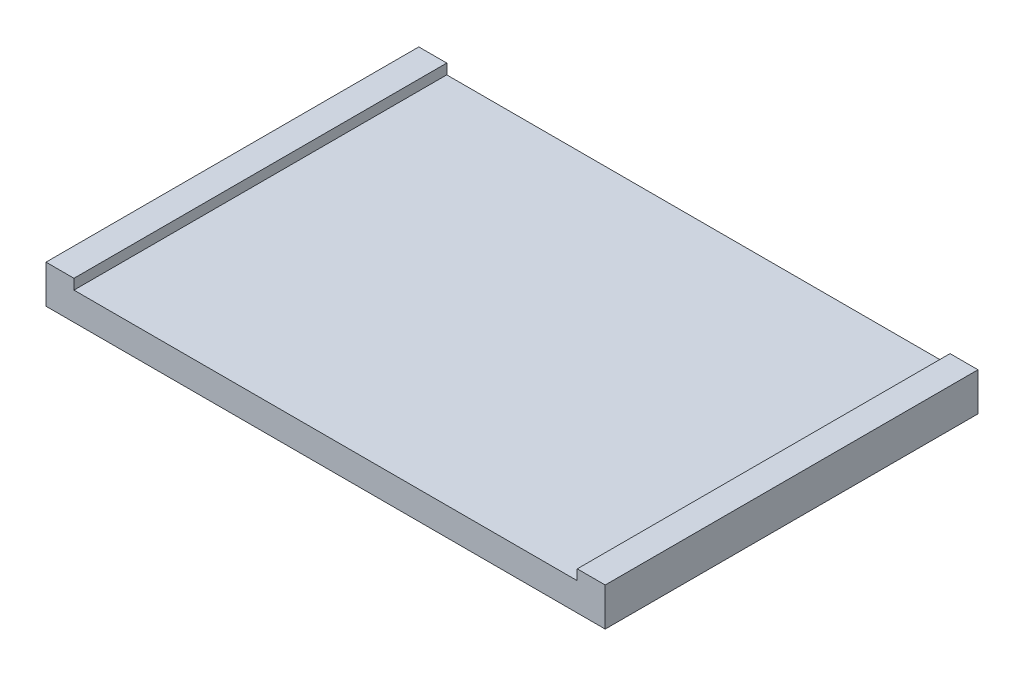
ISO-10303-21;
HEADER;
FILE_DESCRIPTION(('STEP AP214'),'2;1');
FILE_NAME('part.step','',(''),(''),'','','');
FILE_SCHEMA(('AUTOMOTIVE_DESIGN { 1 0 10303 214 1 1 1 1 }'));
ENDSEC;
DATA;
#1=APPLICATION_CONTEXT('core data for automotive mechanical design processes');
#2=APPLICATION_PROTOCOL_DEFINITION('international standard','automotive_design',2000,#1);
#3=PRODUCT_CONTEXT('',#1,'mechanical');
#4=PRODUCT('Part','Part','',(#3));
#5=PRODUCT_RELATED_PRODUCT_CATEGORY('part','',(#4));
#6=PRODUCT_DEFINITION_FORMATION('','',#4);
#7=PRODUCT_DEFINITION_CONTEXT('part definition',#1,'design');
#8=PRODUCT_DEFINITION('design','',#6,#7);
#9=PRODUCT_DEFINITION_SHAPE('','',#8);
#10=(LENGTH_UNIT() NAMED_UNIT(*) SI_UNIT(.MILLI.,.METRE.));
#11=(NAMED_UNIT(*) PLANE_ANGLE_UNIT() SI_UNIT($,.RADIAN.));
#12=(NAMED_UNIT(*) SI_UNIT($,.STERADIAN.) SOLID_ANGLE_UNIT());
#13=UNCERTAINTY_MEASURE_WITH_UNIT(LENGTH_MEASURE(1.E-05),#10,'distance_accuracy_value','');
#14=(GEOMETRIC_REPRESENTATION_CONTEXT(3) GLOBAL_UNCERTAINTY_ASSIGNED_CONTEXT((#13)) GLOBAL_UNIT_ASSIGNED_CONTEXT((#10,
#11,#12)) REPRESENTATION_CONTEXT('',''));
#15=CARTESIAN_POINT('',(0.,0.,0.));
#16=DIRECTION('',(0.,0.,1.));
#17=DIRECTION('',(1.,0.,0.));
#18=AXIS2_PLACEMENT_3D('',#15,#16,#17);
#19=CARTESIAN_POINT('',(0.,1.5,0.));
#20=DIRECTION('',(0.,-1.,0.));
#21=DIRECTION('',(0.,0.,-1.));
#22=AXIS2_PLACEMENT_3D('',#19,#20,#21);
#23=PLANE('',#22);
#24=DIRECTION('',(0.,0.,1.));
#25=VECTOR('',#24,1.);
#26=CARTESIAN_POINT('',(28.5,1.5,0.));
#27=LINE('',#26,#25);
#28=CARTESIAN_POINT('',(28.5,1.5,-20.));
#29=VERTEX_POINT('',#28);
#30=CARTESIAN_POINT('',(28.5,1.5,0.));
#31=VERTEX_POINT('',#30);
#32=EDGE_CURVE('E114',#29,#31,#27,.T.);
#33=ORIENTED_EDGE('',*,*,#32,.F.);
#34=DIRECTION('',(-1.,0.,0.));
#35=VECTOR('',#34,1.);
#36=CARTESIAN_POINT('',(0.,1.5,-20.));
#37=LINE('',#36,#35);
#38=CARTESIAN_POINT('',(1.5,1.5,-20.));
#39=VERTEX_POINT('',#38);
#40=EDGE_CURVE('E102',#29,#39,#37,.T.);
#41=ORIENTED_EDGE('',*,*,#40,.T.);
#42=DIRECTION('',(0.,0.,-1.));
#43=VECTOR('',#42,1.);
#44=CARTESIAN_POINT('',(1.5,1.5,-20.));
#45=LINE('',#44,#43);
#46=CARTESIAN_POINT('',(1.5,1.5,0.));
#47=VERTEX_POINT('',#46);
#48=EDGE_CURVE('E58',#47,#39,#45,.T.);
#49=ORIENTED_EDGE('',*,*,#48,.F.);
#50=DIRECTION('',(1.,0.,0.));
#51=VECTOR('',#50,1.);
#52=CARTESIAN_POINT('',(0.,1.5,0.));
#53=LINE('',#52,#51);
#54=EDGE_CURVE('E53',#47,#31,#53,.T.);
#55=ORIENTED_EDGE('',*,*,#54,.T.);
#56=EDGE_LOOP('',(#33,#41,#49,#55));
#57=FACE_BOUND('',#56,.T.);
#58=ADVANCED_FACE('F38',(#57),#23,.F.);
#59=CARTESIAN_POINT('',(0.,1.5,0.));
#60=DIRECTION('',(1.,0.,0.));
#61=DIRECTION('',(0.,0.,-1.));
#62=AXIS2_PLACEMENT_3D('',#59,#60,#61);
#63=PLANE('',#62);
#64=DIRECTION('',(0.,0.,1.));
#65=VECTOR('',#64,1.);
#66=CARTESIAN_POINT('',(0.,0.,0.));
#67=LINE('',#66,#65);
#68=CARTESIAN_POINT('',(0.,0.,-20.));
#69=VERTEX_POINT('',#68);
#70=CARTESIAN_POINT('',(0.,0.,0.));
#71=VERTEX_POINT('',#70);
#72=EDGE_CURVE('E149',#69,#71,#67,.T.);
#73=ORIENTED_EDGE('',*,*,#72,.T.);
#74=DIRECTION('',(0.,-1.,0.));
#75=VECTOR('',#74,1.);
#76=CARTESIAN_POINT('',(0.,1.5,0.));
#77=LINE('',#76,#75);
#78=CARTESIAN_POINT('',(0.,2.05,0.));
#79=VERTEX_POINT('',#78);
#80=EDGE_CURVE('E11',#79,#71,#77,.T.);
#81=ORIENTED_EDGE('',*,*,#80,.F.);
#82=DIRECTION('',(0.,0.,1.));
#83=VECTOR('',#82,1.);
#84=CARTESIAN_POINT('',(0.,2.05,0.));
#85=LINE('',#84,#83);
#86=CARTESIAN_POINT('',(0.,2.05,-20.));
#87=VERTEX_POINT('',#86);
#88=EDGE_CURVE('E134',#87,#79,#85,.T.);
#89=ORIENTED_EDGE('',*,*,#88,.F.);
#90=DIRECTION('',(0.,-1.,0.));
#91=VECTOR('',#90,1.);
#92=CARTESIAN_POINT('',(0.,1.5,-20.));
#93=LINE('',#92,#91);
#94=EDGE_CURVE('E111',#87,#69,#93,.T.);
#95=ORIENTED_EDGE('',*,*,#94,.T.);
#96=EDGE_LOOP('',(#73,#81,#89,#95));
#97=FACE_BOUND('',#96,.T.);
#98=ADVANCED_FACE('F40',(#97),#63,.F.);
#99=CARTESIAN_POINT('',(0.,1.5,0.));
#100=DIRECTION('',(0.,0.,-1.));
#101=DIRECTION('',(-1.,0.,0.));
#102=AXIS2_PLACEMENT_3D('',#99,#100,#101);
#103=PLANE('',#102);
#104=DIRECTION('',(1.,0.,0.));
#105=VECTOR('',#104,1.);
#106=CARTESIAN_POINT('',(0.,0.,0.));
#107=LINE('',#106,#105);
#108=CARTESIAN_POINT('',(30.,0.,0.));
#109=VERTEX_POINT('',#108);
#110=EDGE_CURVE('E154',#71,#109,#107,.T.);
#111=ORIENTED_EDGE('',*,*,#110,.T.);
#112=DIRECTION('',(0.,-1.,0.));
#113=VECTOR('',#112,1.);
#114=CARTESIAN_POINT('',(30.,1.5,0.));
#115=LINE('',#114,#113);
#116=CARTESIAN_POINT('',(30.,2.05,0.));
#117=VERTEX_POINT('',#116);
#118=EDGE_CURVE('E46',#117,#109,#115,.T.);
#119=ORIENTED_EDGE('',*,*,#118,.F.);
#120=DIRECTION('',(1.,0.,0.));
#121=VECTOR('',#120,1.);
#122=CARTESIAN_POINT('',(30.,2.05,0.));
#123=LINE('',#122,#121);
#124=CARTESIAN_POINT('',(28.5,2.05,0.));
#125=VERTEX_POINT('',#124);
#126=EDGE_CURVE('E130',#125,#117,#123,.T.);
#127=ORIENTED_EDGE('',*,*,#126,.F.);
#128=DIRECTION('',(0.,-1.,0.));
#129=VECTOR('',#128,1.);
#130=CARTESIAN_POINT('',(28.5,2.05,0.));
#131=LINE('',#130,#129);
#132=EDGE_CURVE('E122',#125,#31,#131,.T.);
#133=ORIENTED_EDGE('',*,*,#132,.T.);
#134=ORIENTED_EDGE('',*,*,#54,.F.);
#135=DIRECTION('',(0.,-1.,0.));
#136=VECTOR('',#135,1.);
#137=CARTESIAN_POINT('',(1.5,2.05,0.));
#138=LINE('',#137,#136);
#139=CARTESIAN_POINT('',(1.5,2.05,0.));
#140=VERTEX_POINT('',#139);
#141=EDGE_CURVE('E146',#140,#47,#138,.T.);
#142=ORIENTED_EDGE('',*,*,#141,.F.);
#143=DIRECTION('',(1.,0.,0.));
#144=VECTOR('',#143,1.);
#145=CARTESIAN_POINT('',(1.5,2.05,0.));
#146=LINE('',#145,#144);
#147=EDGE_CURVE('E137',#79,#140,#146,.T.);
#148=ORIENTED_EDGE('',*,*,#147,.F.);
#149=ORIENTED_EDGE('',*,*,#80,.T.);
#150=EDGE_LOOP('',(#111,#119,#127,#133,#134,#142,#148,#149));
#151=FACE_BOUND('',#150,.T.);
#152=ADVANCED_FACE('F182',(#151),#103,.F.);
#153=CARTESIAN_POINT('',(30.,1.5,0.));
#154=DIRECTION('',(-1.,0.,0.));
#155=DIRECTION('',(0.,0.,1.));
#156=AXIS2_PLACEMENT_3D('',#153,#154,#155);
#157=PLANE('',#156);
#158=DIRECTION('',(0.,0.,-1.));
#159=VECTOR('',#158,1.);
#160=CARTESIAN_POINT('',(30.,0.,0.));
#161=LINE('',#160,#159);
#162=CARTESIAN_POINT('',(30.,0.,-20.));
#163=VERTEX_POINT('',#162);
#164=EDGE_CURVE('E156',#109,#163,#161,.T.);
#165=ORIENTED_EDGE('',*,*,#164,.T.);
#166=DIRECTION('',(0.,-1.,0.));
#167=VECTOR('',#166,1.);
#168=CARTESIAN_POINT('',(30.,1.5,-20.));
#169=LINE('',#168,#167);
#170=CARTESIAN_POINT('',(30.,2.05,-20.));
#171=VERTEX_POINT('',#170);
#172=EDGE_CURVE('E161',#171,#163,#169,.T.);
#173=ORIENTED_EDGE('',*,*,#172,.F.);
#174=DIRECTION('',(0.,0.,-1.));
#175=VECTOR('',#174,1.);
#176=CARTESIAN_POINT('',(30.,2.05,-20.));
#177=LINE('',#176,#175);
#178=EDGE_CURVE('E124',#117,#171,#177,.T.);
#179=ORIENTED_EDGE('',*,*,#178,.F.);
#180=ORIENTED_EDGE('',*,*,#118,.T.);
#181=EDGE_LOOP('',(#165,#173,#179,#180));
#182=FACE_BOUND('',#181,.T.);
#183=ADVANCED_FACE('F167',(#182),#157,.F.);
#184=CARTESIAN_POINT('',(0.,1.5,-20.));
#185=DIRECTION('',(0.,0.,1.));
#186=DIRECTION('',(1.,0.,0.));
#187=AXIS2_PLACEMENT_3D('',#184,#185,#186);
#188=PLANE('',#187);
#189=DIRECTION('',(-1.,0.,0.));
#190=VECTOR('',#189,1.);
#191=CARTESIAN_POINT('',(0.,0.,-20.));
#192=LINE('',#191,#190);
#193=EDGE_CURVE('E150',#163,#69,#192,.T.);
#194=ORIENTED_EDGE('',*,*,#193,.T.);
#195=ORIENTED_EDGE('',*,*,#94,.F.);
#196=DIRECTION('',(-1.,0.,0.));
#197=VECTOR('',#196,1.);
#198=CARTESIAN_POINT('',(0.,2.05,-20.));
#199=LINE('',#198,#197);
#200=CARTESIAN_POINT('',(1.5,2.05,-20.));
#201=VERTEX_POINT('',#200);
#202=EDGE_CURVE('E141',#201,#87,#199,.T.);
#203=ORIENTED_EDGE('',*,*,#202,.F.);
#204=DIRECTION('',(0.,-1.,0.));
#205=VECTOR('',#204,1.);
#206=CARTESIAN_POINT('',(1.5,2.05,-20.));
#207=LINE('',#206,#205);
#208=EDGE_CURVE('E110',#201,#39,#207,.T.);
#209=ORIENTED_EDGE('',*,*,#208,.T.);
#210=ORIENTED_EDGE('',*,*,#40,.F.);
#211=DIRECTION('',(0.,-1.,0.));
#212=VECTOR('',#211,1.);
#213=CARTESIAN_POINT('',(28.5,2.05,-20.));
#214=LINE('',#213,#212);
#215=CARTESIAN_POINT('',(28.5,2.05,-20.));
#216=VERTEX_POINT('',#215);
#217=EDGE_CURVE('E106',#216,#29,#214,.T.);
#218=ORIENTED_EDGE('',*,*,#217,.F.);
#219=DIRECTION('',(-1.,0.,0.));
#220=VECTOR('',#219,1.);
#221=CARTESIAN_POINT('',(28.5,2.05,-20.));
#222=LINE('',#221,#220);
#223=EDGE_CURVE('E121',#171,#216,#222,.T.);
#224=ORIENTED_EDGE('',*,*,#223,.F.);
#225=ORIENTED_EDGE('',*,*,#172,.T.);
#226=EDGE_LOOP('',(#194,#195,#203,#209,#210,#218,#224,#225));
#227=FACE_BOUND('',#226,.T.);
#228=ADVANCED_FACE('F103',(#227),#188,.F.);
#229=CARTESIAN_POINT('',(0.,0.,0.));
#230=DIRECTION('',(0.,-1.,0.));
#231=DIRECTION('',(0.,0.,-1.));
#232=AXIS2_PLACEMENT_3D('',#229,#230,#231);
#233=PLANE('',#232);
#234=ORIENTED_EDGE('',*,*,#72,.F.);
#235=ORIENTED_EDGE('',*,*,#193,.F.);
#236=ORIENTED_EDGE('',*,*,#164,.F.);
#237=ORIENTED_EDGE('',*,*,#110,.F.);
#238=EDGE_LOOP('',(#234,#235,#236,#237));
#239=FACE_BOUND('',#238,.T.);
#240=ADVANCED_FACE('F172',(#239),#233,.T.);
#241=CARTESIAN_POINT('',(1.5,2.05,-20.));
#242=DIRECTION('',(-1.,0.,0.));
#243=DIRECTION('',(0.,0.,1.));
#244=AXIS2_PLACEMENT_3D('',#241,#242,#243);
#245=PLANE('',#244);
#246=ORIENTED_EDGE('',*,*,#48,.T.);
#247=ORIENTED_EDGE('',*,*,#208,.F.);
#248=DIRECTION('',(0.,0.,-1.));
#249=VECTOR('',#248,1.);
#250=CARTESIAN_POINT('',(1.5,2.05,-20.));
#251=LINE('',#250,#249);
#252=EDGE_CURVE('E139',#140,#201,#251,.T.);
#253=ORIENTED_EDGE('',*,*,#252,.F.);
#254=ORIENTED_EDGE('',*,*,#141,.T.);
#255=EDGE_LOOP('',(#246,#247,#253,#254));
#256=FACE_BOUND('',#255,.T.);
#257=ADVANCED_FACE('F181',(#256),#245,.F.);
#258=CARTESIAN_POINT('',(0.,2.05,0.));
#259=DIRECTION('',(0.,-1.,0.));
#260=DIRECTION('',(0.,0.,-1.));
#261=AXIS2_PLACEMENT_3D('',#258,#259,#260);
#262=PLANE('',#261);
#263=ORIENTED_EDGE('',*,*,#88,.T.);
#264=ORIENTED_EDGE('',*,*,#147,.T.);
#265=ORIENTED_EDGE('',*,*,#252,.T.);
#266=ORIENTED_EDGE('',*,*,#202,.T.);
#267=EDGE_LOOP('',(#263,#264,#265,#266));
#268=FACE_BOUND('',#267,.T.);
#269=ADVANCED_FACE('F177',(#268),#262,.F.);
#270=CARTESIAN_POINT('',(28.5,2.05,0.));
#271=DIRECTION('',(1.,0.,0.));
#272=DIRECTION('',(0.,0.,-1.));
#273=AXIS2_PLACEMENT_3D('',#270,#271,#272);
#274=PLANE('',#273);
#275=ORIENTED_EDGE('',*,*,#32,.T.);
#276=ORIENTED_EDGE('',*,*,#132,.F.);
#277=DIRECTION('',(0.,0.,1.));
#278=VECTOR('',#277,1.);
#279=CARTESIAN_POINT('',(28.5,2.05,0.));
#280=LINE('',#279,#278);
#281=EDGE_CURVE('E117',#216,#125,#280,.T.);
#282=ORIENTED_EDGE('',*,*,#281,.F.);
#283=ORIENTED_EDGE('',*,*,#217,.T.);
#284=EDGE_LOOP('',(#275,#276,#282,#283));
#285=FACE_BOUND('',#284,.T.);
#286=ADVANCED_FACE('F119',(#285),#274,.F.);
#287=CARTESIAN_POINT('',(0.,2.05,0.));
#288=DIRECTION('',(0.,-1.,0.));
#289=DIRECTION('',(0.,0.,-1.));
#290=AXIS2_PLACEMENT_3D('',#287,#288,#289);
#291=PLANE('',#290);
#292=ORIENTED_EDGE('',*,*,#281,.T.);
#293=ORIENTED_EDGE('',*,*,#126,.T.);
#294=ORIENTED_EDGE('',*,*,#178,.T.);
#295=ORIENTED_EDGE('',*,*,#223,.T.);
#296=EDGE_LOOP('',(#292,#293,#294,#295));
#297=FACE_BOUND('',#296,.T.);
#298=ADVANCED_FACE('F184',(#297),#291,.F.);
#299=CLOSED_SHELL('',(#58,#98,#152,#183,#228,#240,#257,#269,#286,#298));
#300=MANIFOLD_SOLID_BREP('B2',#299);
#301=ADVANCED_BREP_SHAPE_REPRESENTATION('',(#18,#300),#14);
#302=SHAPE_DEFINITION_REPRESENTATION(#9,#301);
ENDSEC;
END-ISO-10303-21;
